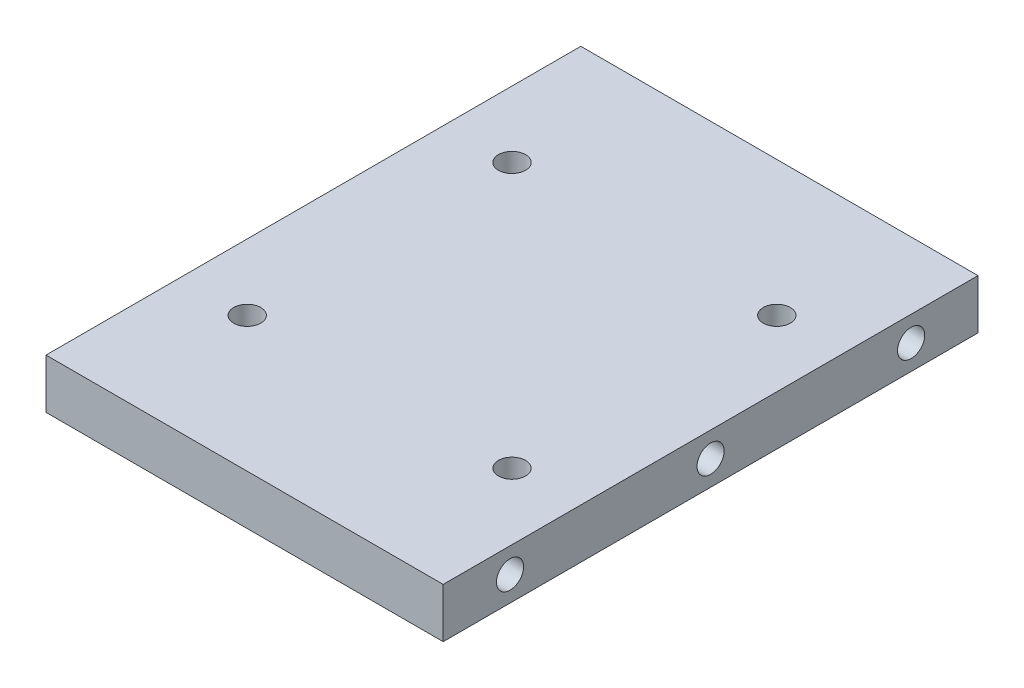
ISO-10303-21;
HEADER;
FILE_DESCRIPTION(('STEP AP214'),'2;1');
FILE_NAME('part.step','',(''),(''),'','','');
FILE_SCHEMA(('AUTOMOTIVE_DESIGN { 1 0 10303 214 1 1 1 1 }'));
ENDSEC;
DATA;
#1=APPLICATION_CONTEXT('core data for automotive mechanical design processes');
#2=APPLICATION_PROTOCOL_DEFINITION('international standard','automotive_design',2000,#1);
#3=PRODUCT_CONTEXT('',#1,'mechanical');
#4=PRODUCT('Part','Part','',(#3));
#5=PRODUCT_RELATED_PRODUCT_CATEGORY('part','',(#4));
#6=PRODUCT_DEFINITION_FORMATION('','',#4);
#7=PRODUCT_DEFINITION_CONTEXT('part definition',#1,'design');
#8=PRODUCT_DEFINITION('design','',#6,#7);
#9=PRODUCT_DEFINITION_SHAPE('','',#8);
#10=(LENGTH_UNIT() NAMED_UNIT(*) SI_UNIT(.MILLI.,.METRE.));
#11=(NAMED_UNIT(*) PLANE_ANGLE_UNIT() SI_UNIT($,.RADIAN.));
#12=(NAMED_UNIT(*) SI_UNIT($,.STERADIAN.) SOLID_ANGLE_UNIT());
#13=UNCERTAINTY_MEASURE_WITH_UNIT(LENGTH_MEASURE(1.E-05),#10,'distance_accuracy_value','');
#14=(GEOMETRIC_REPRESENTATION_CONTEXT(3) GLOBAL_UNCERTAINTY_ASSIGNED_CONTEXT((#13)) GLOBAL_UNIT_ASSIGNED_CONTEXT((#10,
#11,#12)) REPRESENTATION_CONTEXT('',''));
#15=CARTESIAN_POINT('',(0.,0.,0.));
#16=DIRECTION('',(0.,0.,1.));
#17=DIRECTION('',(1.,0.,0.));
#18=AXIS2_PLACEMENT_3D('',#15,#16,#17);
#19=CARTESIAN_POINT('',(0.,79.5,0.));
#20=DIRECTION('',(0.,1.,0.));
#21=DIRECTION('',(0.,0.,1.));
#22=AXIS2_PLACEMENT_3D('',#19,#20,#21);
#23=PLANE('',#22);
#24=CARTESIAN_POINT('',(-25.4,79.5,-25.4));
#25=DIRECTION('',(0.,1.,0.));
#26=DIRECTION('',(0.,0.,1.));
#27=AXIS2_PLACEMENT_3D('',#24,#25,#26);
#28=CIRCLE('',#27,2.6035);
#29=CARTESIAN_POINT('',(-25.4,79.5,-28.0035));
#30=VERTEX_POINT('',#29);
#31=EDGE_CURVE('E121',#30,#30,#28,.T.);
#32=ORIENTED_EDGE('',*,*,#31,.F.);
#33=EDGE_LOOP('',(#32));
#34=FACE_BOUND('',#33,.T.);
#35=CARTESIAN_POINT('',(25.4,79.5,25.4));
#36=DIRECTION('',(0.,1.,0.));
#37=DIRECTION('',(0.,0.,1.));
#38=AXIS2_PLACEMENT_3D('',#35,#36,#37);
#39=CIRCLE('',#38,2.6035);
#40=CARTESIAN_POINT('',(25.4,79.5,22.7965));
#41=VERTEX_POINT('',#40);
#42=EDGE_CURVE('E100',#41,#41,#39,.T.);
#43=ORIENTED_EDGE('',*,*,#42,.F.);
#44=EDGE_LOOP('',(#43));
#45=FACE_BOUND('',#44,.T.);
#46=DIRECTION('',(0.,0.,1.));
#47=VECTOR('',#46,1.);
#48=CARTESIAN_POINT('',(-38.1,79.5,51.3016508018992));
#49=LINE('',#48,#47);
#50=CARTESIAN_POINT('',(-38.1,79.5,-51.3016508018992));
#51=VERTEX_POINT('',#50);
#52=CARTESIAN_POINT('',(-38.1,79.5,51.3016508018992));
#53=VERTEX_POINT('',#52);
#54=EDGE_CURVE('E85',#51,#53,#49,.T.);
#55=ORIENTED_EDGE('',*,*,#54,.T.);
#56=DIRECTION('',(1.,0.,0.));
#57=VECTOR('',#56,1.);
#58=CARTESIAN_POINT('',(-38.1,79.5,51.3016508018992));
#59=LINE('',#58,#57);
#60=CARTESIAN_POINT('',(38.1,79.5,51.3016508018992));
#61=VERTEX_POINT('',#60);
#62=EDGE_CURVE('E80',#53,#61,#59,.T.);
#63=ORIENTED_EDGE('',*,*,#62,.T.);
#64=DIRECTION('',(0.,0.,-1.));
#65=VECTOR('',#64,1.);
#66=CARTESIAN_POINT('',(38.1,79.5,-51.3016508018992));
#67=LINE('',#66,#65);
#68=CARTESIAN_POINT('',(38.1,79.5,-51.3016508018992));
#69=VERTEX_POINT('',#68);
#70=EDGE_CURVE('E83',#61,#69,#67,.T.);
#71=ORIENTED_EDGE('',*,*,#70,.T.);
#72=DIRECTION('',(-1.,0.,0.));
#73=VECTOR('',#72,1.);
#74=CARTESIAN_POINT('',(38.1,79.5,-51.3016508018992));
#75=LINE('',#74,#73);
#76=EDGE_CURVE('E50',#69,#51,#75,.T.);
#77=ORIENTED_EDGE('',*,*,#76,.T.);
#78=EDGE_LOOP('',(#55,#63,#71,#77));
#79=FACE_BOUND('',#78,.T.);
#80=CARTESIAN_POINT('',(-25.4,79.5,25.4));
#81=DIRECTION('',(0.,1.,0.));
#82=DIRECTION('',(0.,0.,1.));
#83=AXIS2_PLACEMENT_3D('',#80,#81,#82);
#84=CIRCLE('',#83,2.6035);
#85=CARTESIAN_POINT('',(-25.4,79.5,22.7965));
#86=VERTEX_POINT('',#85);
#87=EDGE_CURVE('E115',#86,#86,#84,.T.);
#88=ORIENTED_EDGE('',*,*,#87,.F.);
#89=EDGE_LOOP('',(#88));
#90=FACE_BOUND('',#89,.T.);
#91=CARTESIAN_POINT('',(25.4,79.5,-25.4));
#92=DIRECTION('',(0.,1.,0.));
#93=DIRECTION('',(0.,0.,1.));
#94=AXIS2_PLACEMENT_3D('',#91,#92,#93);
#95=CIRCLE('',#94,2.6035);
#96=CARTESIAN_POINT('',(25.4,79.5,-28.0035));
#97=VERTEX_POINT('',#96);
#98=EDGE_CURVE('E127',#97,#97,#95,.T.);
#99=ORIENTED_EDGE('',*,*,#98,.F.);
#100=EDGE_LOOP('',(#99));
#101=FACE_BOUND('',#100,.T.);
#102=ADVANCED_FACE('F33',(#34,#45,#79,#90,#101),#23,.T.);
#103=CARTESIAN_POINT('',(0.,69.975,0.));
#104=DIRECTION('',(0.,1.,0.));
#105=DIRECTION('',(0.,0.,1.));
#106=AXIS2_PLACEMENT_3D('',#103,#104,#105);
#107=PLANE('',#106);
#108=DIRECTION('',(0.,0.,1.));
#109=VECTOR('',#108,1.);
#110=CARTESIAN_POINT('',(-38.1,69.975,51.3016508018992));
#111=LINE('',#110,#109);
#112=CARTESIAN_POINT('',(-38.1,69.975,-51.3016508018992));
#113=VERTEX_POINT('',#112);
#114=CARTESIAN_POINT('',(-38.1,69.975,51.3016508018992));
#115=VERTEX_POINT('',#114);
#116=EDGE_CURVE('E97',#113,#115,#111,.T.);
#117=ORIENTED_EDGE('',*,*,#116,.F.);
#118=DIRECTION('',(-1.,0.,0.));
#119=VECTOR('',#118,1.);
#120=CARTESIAN_POINT('',(38.1,69.975,-51.3016508018992));
#121=LINE('',#120,#119);
#122=CARTESIAN_POINT('',(38.1,69.975,-51.3016508018992));
#123=VERTEX_POINT('',#122);
#124=EDGE_CURVE('E73',#123,#113,#121,.T.);
#125=ORIENTED_EDGE('',*,*,#124,.F.);
#126=DIRECTION('',(0.,0.,-1.));
#127=VECTOR('',#126,1.);
#128=CARTESIAN_POINT('',(38.1,69.975,-51.3016508018992));
#129=LINE('',#128,#127);
#130=CARTESIAN_POINT('',(38.1,69.975,51.3016508018992));
#131=VERTEX_POINT('',#130);
#132=EDGE_CURVE('E67',#131,#123,#129,.T.);
#133=ORIENTED_EDGE('',*,*,#132,.F.);
#134=DIRECTION('',(1.,0.,0.));
#135=VECTOR('',#134,1.);
#136=CARTESIAN_POINT('',(-38.1,69.975,51.3016508018992));
#137=LINE('',#136,#135);
#138=EDGE_CURVE('E89',#115,#131,#137,.T.);
#139=ORIENTED_EDGE('',*,*,#138,.F.);
#140=EDGE_LOOP('',(#117,#125,#133,#139));
#141=FACE_BOUND('',#140,.T.);
#142=CARTESIAN_POINT('',(25.4,69.975,25.4));
#143=DIRECTION('',(0.,1.,0.));
#144=DIRECTION('',(0.,0.,1.));
#145=AXIS2_PLACEMENT_3D('',#142,#143,#144);
#146=CIRCLE('',#145,2.6035);
#147=CARTESIAN_POINT('',(25.4,69.975,22.7965));
#148=VERTEX_POINT('',#147);
#149=EDGE_CURVE('E112',#148,#148,#146,.T.);
#150=ORIENTED_EDGE('',*,*,#149,.T.);
#151=EDGE_LOOP('',(#150));
#152=FACE_BOUND('',#151,.T.);
#153=CARTESIAN_POINT('',(-25.4,69.975,25.4));
#154=DIRECTION('',(0.,1.,0.));
#155=DIRECTION('',(0.,0.,1.));
#156=AXIS2_PLACEMENT_3D('',#153,#154,#155);
#157=CIRCLE('',#156,2.6035);
#158=CARTESIAN_POINT('',(-25.4,69.975,22.7965));
#159=VERTEX_POINT('',#158);
#160=EDGE_CURVE('E118',#159,#159,#157,.T.);
#161=ORIENTED_EDGE('',*,*,#160,.T.);
#162=EDGE_LOOP('',(#161));
#163=FACE_BOUND('',#162,.T.);
#164=CARTESIAN_POINT('',(-25.4,69.975,-25.4));
#165=DIRECTION('',(0.,1.,0.));
#166=DIRECTION('',(0.,0.,1.));
#167=AXIS2_PLACEMENT_3D('',#164,#165,#166);
#168=CIRCLE('',#167,2.6035);
#169=CARTESIAN_POINT('',(-25.4,69.975,-28.0035));
#170=VERTEX_POINT('',#169);
#171=EDGE_CURVE('E124',#170,#170,#168,.T.);
#172=ORIENTED_EDGE('',*,*,#171,.T.);
#173=EDGE_LOOP('',(#172));
#174=FACE_BOUND('',#173,.T.);
#175=CARTESIAN_POINT('',(25.4,69.975,-25.4));
#176=DIRECTION('',(0.,1.,0.));
#177=DIRECTION('',(0.,0.,1.));
#178=AXIS2_PLACEMENT_3D('',#175,#176,#177);
#179=CIRCLE('',#178,2.6035);
#180=CARTESIAN_POINT('',(25.4,69.975,-28.0035));
#181=VERTEX_POINT('',#180);
#182=EDGE_CURVE('E130',#181,#181,#179,.T.);
#183=ORIENTED_EDGE('',*,*,#182,.T.);
#184=EDGE_LOOP('',(#183));
#185=FACE_BOUND('',#184,.T.);
#186=ADVANCED_FACE('F108',(#141,#152,#163,#174,#185),#107,.F.);
#187=CARTESIAN_POINT('',(-38.1,79.5,51.3016508018992));
#188=DIRECTION('',(1.,0.,0.));
#189=DIRECTION('',(0.,0.,-1.));
#190=AXIS2_PLACEMENT_3D('',#187,#188,#189);
#191=PLANE('',#190);
#192=CARTESIAN_POINT('',(-38.1,74.7375,38.4762381014244));
#193=DIRECTION('',(-1.,0.,0.));
#194=DIRECTION('',(0.,0.,-1.));
#195=AXIS2_PLACEMENT_3D('',#192,#193,#194);
#196=CIRCLE('',#195,2.6035);
#197=CARTESIAN_POINT('',(-38.1,74.7375,41.0797381014244));
#198=VERTEX_POINT('',#197);
#199=EDGE_CURVE('E142',#198,#198,#196,.T.);
#200=ORIENTED_EDGE('',*,*,#199,.F.);
#201=EDGE_LOOP('',(#200));
#202=FACE_BOUND('',#201,.T.);
#203=CARTESIAN_POINT('',(-38.1,74.7375,-38.4762381014244));
#204=DIRECTION('',(-1.,0.,0.));
#205=DIRECTION('',(0.,0.,1.));
#206=AXIS2_PLACEMENT_3D('',#203,#204,#205);
#207=CIRCLE('',#206,2.6035);
#208=CARTESIAN_POINT('',(-38.1,74.7375,-35.8727381014244));
#209=VERTEX_POINT('',#208);
#210=EDGE_CURVE('E148',#209,#209,#207,.T.);
#211=ORIENTED_EDGE('',*,*,#210,.F.);
#212=EDGE_LOOP('',(#211));
#213=FACE_BOUND('',#212,.T.);
#214=CARTESIAN_POINT('',(-38.1,74.7375,0.));
#215=DIRECTION('',(-1.,0.,0.));
#216=DIRECTION('',(0.,0.,1.));
#217=AXIS2_PLACEMENT_3D('',#214,#215,#216);
#218=CIRCLE('',#217,2.6035);
#219=CARTESIAN_POINT('',(-38.1,74.7375,2.6035));
#220=VERTEX_POINT('',#219);
#221=EDGE_CURVE('E136',#220,#220,#218,.T.);
#222=ORIENTED_EDGE('',*,*,#221,.F.);
#223=EDGE_LOOP('',(#222));
#224=FACE_BOUND('',#223,.T.);
#225=ORIENTED_EDGE('',*,*,#116,.T.);
#226=DIRECTION('',(0.,-1.,0.));
#227=VECTOR('',#226,1.);
#228=CARTESIAN_POINT('',(-38.1,79.5,51.3016508018992));
#229=LINE('',#228,#227);
#230=EDGE_CURVE('E11',#53,#115,#229,.T.);
#231=ORIENTED_EDGE('',*,*,#230,.F.);
#232=ORIENTED_EDGE('',*,*,#54,.F.);
#233=DIRECTION('',(0.,-1.,0.));
#234=VECTOR('',#233,1.);
#235=CARTESIAN_POINT('',(-38.1,79.5,-51.3016508018992));
#236=LINE('',#235,#234);
#237=EDGE_CURVE('E93',#51,#113,#236,.T.);
#238=ORIENTED_EDGE('',*,*,#237,.T.);
#239=EDGE_LOOP('',(#225,#231,#232,#238));
#240=FACE_BOUND('',#239,.T.);
#241=ADVANCED_FACE('F35',(#202,#213,#224,#240),#191,.F.);
#242=CARTESIAN_POINT('',(-38.1,79.5,51.3016508018992));
#243=DIRECTION('',(0.,0.,-1.));
#244=DIRECTION('',(-1.,0.,0.));
#245=AXIS2_PLACEMENT_3D('',#242,#243,#244);
#246=PLANE('',#245);
#247=ORIENTED_EDGE('',*,*,#138,.T.);
#248=DIRECTION('',(0.,-1.,0.));
#249=VECTOR('',#248,1.);
#250=CARTESIAN_POINT('',(38.1,79.5,51.3016508018992));
#251=LINE('',#250,#249);
#252=EDGE_CURVE('E42',#61,#131,#251,.T.);
#253=ORIENTED_EDGE('',*,*,#252,.F.);
#254=ORIENTED_EDGE('',*,*,#62,.F.);
#255=ORIENTED_EDGE('',*,*,#230,.T.);
#256=EDGE_LOOP('',(#247,#253,#254,#255));
#257=FACE_BOUND('',#256,.T.);
#258=ADVANCED_FACE('F88',(#257),#246,.F.);
#259=CARTESIAN_POINT('',(38.1,79.5,-51.3016508018992));
#260=DIRECTION('',(-1.,0.,0.));
#261=DIRECTION('',(0.,0.,1.));
#262=AXIS2_PLACEMENT_3D('',#259,#260,#261);
#263=PLANE('',#262);
#264=CARTESIAN_POINT('',(38.1,74.7375,38.4762381014244));
#265=DIRECTION('',(-1.,0.,0.));
#266=DIRECTION('',(0.,0.,-1.));
#267=AXIS2_PLACEMENT_3D('',#264,#265,#266);
#268=CIRCLE('',#267,2.6035);
#269=CARTESIAN_POINT('',(38.1,74.7375,41.0797381014244));
#270=VERTEX_POINT('',#269);
#271=EDGE_CURVE('E145',#270,#270,#268,.T.);
#272=ORIENTED_EDGE('',*,*,#271,.T.);
#273=EDGE_LOOP('',(#272));
#274=FACE_BOUND('',#273,.T.);
#275=CARTESIAN_POINT('',(38.1,74.7375,-38.4762381014244));
#276=DIRECTION('',(-1.,0.,0.));
#277=DIRECTION('',(0.,0.,1.));
#278=AXIS2_PLACEMENT_3D('',#275,#276,#277);
#279=CIRCLE('',#278,2.6035);
#280=CARTESIAN_POINT('',(38.1,74.7375,-35.8727381014244));
#281=VERTEX_POINT('',#280);
#282=EDGE_CURVE('E139',#281,#281,#279,.T.);
#283=ORIENTED_EDGE('',*,*,#282,.T.);
#284=EDGE_LOOP('',(#283));
#285=FACE_BOUND('',#284,.T.);
#286=CARTESIAN_POINT('',(38.1,74.7375,0.));
#287=DIRECTION('',(-1.,0.,0.));
#288=DIRECTION('',(0.,0.,1.));
#289=AXIS2_PLACEMENT_3D('',#286,#287,#288);
#290=CIRCLE('',#289,2.6035);
#291=CARTESIAN_POINT('',(38.1,74.7375,2.6035));
#292=VERTEX_POINT('',#291);
#293=EDGE_CURVE('E133',#292,#292,#290,.T.);
#294=ORIENTED_EDGE('',*,*,#293,.T.);
#295=EDGE_LOOP('',(#294));
#296=FACE_BOUND('',#295,.T.);
#297=ORIENTED_EDGE('',*,*,#132,.T.);
#298=DIRECTION('',(0.,-1.,0.));
#299=VECTOR('',#298,1.);
#300=CARTESIAN_POINT('',(38.1,79.5,-51.3016508018992));
#301=LINE('',#300,#299);
#302=EDGE_CURVE('E90',#69,#123,#301,.T.);
#303=ORIENTED_EDGE('',*,*,#302,.F.);
#304=ORIENTED_EDGE('',*,*,#70,.F.);
#305=ORIENTED_EDGE('',*,*,#252,.T.);
#306=EDGE_LOOP('',(#297,#303,#304,#305));
#307=FACE_BOUND('',#306,.T.);
#308=ADVANCED_FACE('F91',(#274,#285,#296,#307),#263,.F.);
#309=CARTESIAN_POINT('',(38.1,79.5,-51.3016508018992));
#310=DIRECTION('',(0.,0.,1.));
#311=DIRECTION('',(1.,0.,0.));
#312=AXIS2_PLACEMENT_3D('',#309,#310,#311);
#313=PLANE('',#312);
#314=ORIENTED_EDGE('',*,*,#124,.T.);
#315=ORIENTED_EDGE('',*,*,#237,.F.);
#316=ORIENTED_EDGE('',*,*,#76,.F.);
#317=ORIENTED_EDGE('',*,*,#302,.T.);
#318=EDGE_LOOP('',(#314,#315,#316,#317));
#319=FACE_BOUND('',#318,.T.);
#320=ADVANCED_FACE('F105',(#319),#313,.F.);
#321=CARTESIAN_POINT('',(25.4,79.5,25.4));
#322=DIRECTION('',(0.,-1.,0.));
#323=DIRECTION('',(0.,0.,-1.));
#324=AXIS2_PLACEMENT_3D('',#321,#322,#323);
#325=CYLINDRICAL_SURFACE('',#324,2.6035);
#326=CARTESIAN_POINT('',(25.4,79.5,22.7965));
#327=CARTESIAN_POINT('',(25.4,79.40078125,22.7965));
#328=CARTESIAN_POINT('',(25.4,79.3015625,22.7965));
#329=CARTESIAN_POINT('',(25.4,79.103125,22.7965));
#330=CARTESIAN_POINT('',(25.4,79.00390625,22.7965));
#331=CARTESIAN_POINT('',(25.4,78.80546875,22.7965));
#332=CARTESIAN_POINT('',(25.4,78.70625,22.7965));
#333=CARTESIAN_POINT('',(25.4,78.5078125,22.7965));
#334=CARTESIAN_POINT('',(25.4,78.40859375,22.7965));
#335=CARTESIAN_POINT('',(25.4,78.21015625,22.7965));
#336=CARTESIAN_POINT('',(25.4,78.1109375,22.7965));
#337=CARTESIAN_POINT('',(25.4,77.9125,22.7965));
#338=CARTESIAN_POINT('',(25.4,77.81328125,22.7965));
#339=CARTESIAN_POINT('',(25.4,77.61484375,22.7965));
#340=CARTESIAN_POINT('',(25.4,77.515625,22.7965));
#341=CARTESIAN_POINT('',(25.4,77.3171875,22.7965));
#342=CARTESIAN_POINT('',(25.4,77.21796875,22.7965));
#343=CARTESIAN_POINT('',(25.4,77.01953125,22.7965));
#344=CARTESIAN_POINT('',(25.4,76.9203125,22.7965));
#345=CARTESIAN_POINT('',(25.4,76.721875,22.7965));
#346=CARTESIAN_POINT('',(25.4,76.62265625,22.7965));
#347=CARTESIAN_POINT('',(25.4,76.42421875,22.7965));
#348=CARTESIAN_POINT('',(25.4,76.325,22.7965));
#349=CARTESIAN_POINT('',(25.4,76.1265625,22.7965));
#350=CARTESIAN_POINT('',(25.4,76.02734375,22.7965));
#351=CARTESIAN_POINT('',(25.4,75.82890625,22.7965));
#352=CARTESIAN_POINT('',(25.4,75.7296875,22.7965));
#353=CARTESIAN_POINT('',(25.4,75.53125,22.7965));
#354=CARTESIAN_POINT('',(25.4,75.43203125,22.7965));
#355=CARTESIAN_POINT('',(25.4,75.23359375,22.7965));
#356=CARTESIAN_POINT('',(25.4,75.134375,22.7965));
#357=CARTESIAN_POINT('',(25.4,74.9359375,22.7965));
#358=CARTESIAN_POINT('',(25.4,74.83671875,22.7965));
#359=CARTESIAN_POINT('',(25.4,74.63828125,22.7965));
#360=CARTESIAN_POINT('',(25.4,74.5390625,22.7965));
#361=CARTESIAN_POINT('',(25.4,74.340625,22.7965));
#362=CARTESIAN_POINT('',(25.4,74.24140625,22.7965));
#363=CARTESIAN_POINT('',(25.4,74.04296875,22.7965));
#364=CARTESIAN_POINT('',(25.4,73.94375,22.7965));
#365=CARTESIAN_POINT('',(25.4,73.7453125,22.7965));
#366=CARTESIAN_POINT('',(25.4,73.64609375,22.7965));
#367=CARTESIAN_POINT('',(25.4,73.44765625,22.7965));
#368=CARTESIAN_POINT('',(25.4,73.3484375,22.7965));
#369=CARTESIAN_POINT('',(25.4,73.15,22.7965));
#370=CARTESIAN_POINT('',(25.4,73.05078125,22.7965));
#371=CARTESIAN_POINT('',(25.4,72.85234375,22.7965));
#372=CARTESIAN_POINT('',(25.4,72.753125,22.7965));
#373=CARTESIAN_POINT('',(25.4,72.5546875,22.7965));
#374=CARTESIAN_POINT('',(25.4,72.45546875,22.7965));
#375=CARTESIAN_POINT('',(25.4,72.25703125,22.7965));
#376=CARTESIAN_POINT('',(25.4,72.1578125,22.7965));
#377=CARTESIAN_POINT('',(25.4,71.959375,22.7965));
#378=CARTESIAN_POINT('',(25.4,71.86015625,22.7965));
#379=CARTESIAN_POINT('',(25.4,71.66171875,22.7965));
#380=CARTESIAN_POINT('',(25.4,71.5625,22.7965));
#381=CARTESIAN_POINT('',(25.4,71.3640625,22.7965));
#382=CARTESIAN_POINT('',(25.4,71.26484375,22.7965));
#383=CARTESIAN_POINT('',(25.4,71.06640625,22.7965));
#384=CARTESIAN_POINT('',(25.4,70.9671875,22.7965));
#385=CARTESIAN_POINT('',(25.4,70.76875,22.7965));
#386=CARTESIAN_POINT('',(25.4,70.66953125,22.7965));
#387=CARTESIAN_POINT('',(25.4,70.47109375,22.7965));
#388=CARTESIAN_POINT('',(25.4,70.371875,22.7965));
#389=CARTESIAN_POINT('',(25.4,70.1734375,22.7965));
#390=CARTESIAN_POINT('',(25.4,70.07421875,22.7965));
#391=CARTESIAN_POINT('',(25.4,69.975,22.7965));
#392=B_SPLINE_CURVE_WITH_KNOTS('',3,(#326,#327,#328,#329,#330,#331,#332,#333,#334,#335,#336,
#337,#338,#339,#340,#341,#342,#343,#344,#345,#346,#347,#348,#349,#350,#351,#352,#353,#354,#355,
#356,#357,#358,#359,#360,#361,#362,#363,#364,#365,#366,#367,#368,#369,#370,#371,#372,#373,#374,
#375,#376,#377,#378,#379,#380,#381,#382,#383,#384,#385,#386,#387,#388,#389,#390,#391),
.UNSPECIFIED.,.F.,.F.,(4,2,2,2,2,2,2,2,2,2,2,2,2,2,2,2,2,2,2,2,2,2,2,2,2,2,2,2,2,2,2,2,4),(0.,
0.297656249999986,0.595312499999986,0.892968749999987,1.19062499999999,1.48828124999999,
1.78593749999999,2.08359374999999,2.38124999999999,2.67890624999999,2.97656249999999,
3.27421874999999,3.57187499999999,3.86953124999999,4.16718749999999,4.46484374999999,
4.76249999999999,5.06015624999999,5.35781249999999,5.65546874999999,5.95312499999999,
6.25078124999999,6.54843749999999,6.84609374999999,7.14374999999999,7.44140624999999,
7.73906249999999,8.03671874999999,8.33437499999999,8.63203124999999,8.92968749999999,
9.22734374999999,9.52499999999999),.UNSPECIFIED.);
#393=EDGE_CURVE('BSEAM191',#41,#148,#392,.T.);
#394=ORIENTED_EDGE('',*,*,#42,.T.);
#395=ORIENTED_EDGE('',*,*,#149,.F.);
#396=ORIENTED_EDGE('',*,*,#393,.T.);
#397=ORIENTED_EDGE('',*,*,#393,.F.);
#398=EDGE_LOOP('',(#394,#396,#395,#397));
#399=FACE_BOUND('',#398,.T.);
#400=ADVANCED_FACE('F191',(#399),#325,.F.);
#401=CARTESIAN_POINT('',(-25.4,79.5,25.4));
#402=DIRECTION('',(0.,-1.,0.));
#403=DIRECTION('',(0.,0.,-1.));
#404=AXIS2_PLACEMENT_3D('',#401,#402,#403);
#405=CYLINDRICAL_SURFACE('',#404,2.6035);
#406=CARTESIAN_POINT('',(-25.4,79.5,22.7965));
#407=CARTESIAN_POINT('',(-25.4,79.40078125,22.7965));
#408=CARTESIAN_POINT('',(-25.4,79.3015625,22.7965));
#409=CARTESIAN_POINT('',(-25.4,79.103125,22.7965));
#410=CARTESIAN_POINT('',(-25.4,79.00390625,22.7965));
#411=CARTESIAN_POINT('',(-25.4,78.80546875,22.7965));
#412=CARTESIAN_POINT('',(-25.4,78.70625,22.7965));
#413=CARTESIAN_POINT('',(-25.4,78.5078125,22.7965));
#414=CARTESIAN_POINT('',(-25.4,78.40859375,22.7965));
#415=CARTESIAN_POINT('',(-25.4,78.21015625,22.7965));
#416=CARTESIAN_POINT('',(-25.4,78.1109375,22.7965));
#417=CARTESIAN_POINT('',(-25.4,77.9125,22.7965));
#418=CARTESIAN_POINT('',(-25.4,77.81328125,22.7965));
#419=CARTESIAN_POINT('',(-25.4,77.61484375,22.7965));
#420=CARTESIAN_POINT('',(-25.4,77.515625,22.7965));
#421=CARTESIAN_POINT('',(-25.4,77.3171875,22.7965));
#422=CARTESIAN_POINT('',(-25.4,77.21796875,22.7965));
#423=CARTESIAN_POINT('',(-25.4,77.01953125,22.7965));
#424=CARTESIAN_POINT('',(-25.4,76.9203125,22.7965));
#425=CARTESIAN_POINT('',(-25.4,76.721875,22.7965));
#426=CARTESIAN_POINT('',(-25.4,76.62265625,22.7965));
#427=CARTESIAN_POINT('',(-25.4,76.42421875,22.7965));
#428=CARTESIAN_POINT('',(-25.4,76.325,22.7965));
#429=CARTESIAN_POINT('',(-25.4,76.1265625,22.7965));
#430=CARTESIAN_POINT('',(-25.4,76.02734375,22.7965));
#431=CARTESIAN_POINT('',(-25.4,75.82890625,22.7965));
#432=CARTESIAN_POINT('',(-25.4,75.7296875,22.7965));
#433=CARTESIAN_POINT('',(-25.4,75.53125,22.7965));
#434=CARTESIAN_POINT('',(-25.4,75.43203125,22.7965));
#435=CARTESIAN_POINT('',(-25.4,75.23359375,22.7965));
#436=CARTESIAN_POINT('',(-25.4,75.134375,22.7965));
#437=CARTESIAN_POINT('',(-25.4,74.9359375,22.7965));
#438=CARTESIAN_POINT('',(-25.4,74.83671875,22.7965));
#439=CARTESIAN_POINT('',(-25.4,74.63828125,22.7965));
#440=CARTESIAN_POINT('',(-25.4,74.5390625,22.7965));
#441=CARTESIAN_POINT('',(-25.4,74.340625,22.7965));
#442=CARTESIAN_POINT('',(-25.4,74.24140625,22.7965));
#443=CARTESIAN_POINT('',(-25.4,74.04296875,22.7965));
#444=CARTESIAN_POINT('',(-25.4,73.94375,22.7965));
#445=CARTESIAN_POINT('',(-25.4,73.7453125,22.7965));
#446=CARTESIAN_POINT('',(-25.4,73.64609375,22.7965));
#447=CARTESIAN_POINT('',(-25.4,73.44765625,22.7965));
#448=CARTESIAN_POINT('',(-25.4,73.3484375,22.7965));
#449=CARTESIAN_POINT('',(-25.4,73.15,22.7965));
#450=CARTESIAN_POINT('',(-25.4,73.05078125,22.7965));
#451=CARTESIAN_POINT('',(-25.4,72.85234375,22.7965));
#452=CARTESIAN_POINT('',(-25.4,72.753125,22.7965));
#453=CARTESIAN_POINT('',(-25.4,72.5546875,22.7965));
#454=CARTESIAN_POINT('',(-25.4,72.45546875,22.7965));
#455=CARTESIAN_POINT('',(-25.4,72.25703125,22.7965));
#456=CARTESIAN_POINT('',(-25.4,72.1578125,22.7965));
#457=CARTESIAN_POINT('',(-25.4,71.959375,22.7965));
#458=CARTESIAN_POINT('',(-25.4,71.86015625,22.7965));
#459=CARTESIAN_POINT('',(-25.4,71.66171875,22.7965));
#460=CARTESIAN_POINT('',(-25.4,71.5625,22.7965));
#461=CARTESIAN_POINT('',(-25.4,71.3640625,22.7965));
#462=CARTESIAN_POINT('',(-25.4,71.26484375,22.7965));
#463=CARTESIAN_POINT('',(-25.4,71.06640625,22.7965));
#464=CARTESIAN_POINT('',(-25.4,70.9671875,22.7965));
#465=CARTESIAN_POINT('',(-25.4,70.76875,22.7965));
#466=CARTESIAN_POINT('',(-25.4,70.66953125,22.7965));
#467=CARTESIAN_POINT('',(-25.4,70.47109375,22.7965));
#468=CARTESIAN_POINT('',(-25.4,70.371875,22.7965));
#469=CARTESIAN_POINT('',(-25.4,70.1734375,22.7965));
#470=CARTESIAN_POINT('',(-25.4,70.07421875,22.7965));
#471=CARTESIAN_POINT('',(-25.4,69.975,22.7965));
#472=B_SPLINE_CURVE_WITH_KNOTS('',3,(#406,#407,#408,#409,#410,#411,#412,#413,#414,#415,#416,
#417,#418,#419,#420,#421,#422,#423,#424,#425,#426,#427,#428,#429,#430,#431,#432,#433,#434,#435,
#436,#437,#438,#439,#440,#441,#442,#443,#444,#445,#446,#447,#448,#449,#450,#451,#452,#453,#454,
#455,#456,#457,#458,#459,#460,#461,#462,#463,#464,#465,#466,#467,#468,#469,#470,#471),
.UNSPECIFIED.,.F.,.F.,(4,2,2,2,2,2,2,2,2,2,2,2,2,2,2,2,2,2,2,2,2,2,2,2,2,2,2,2,2,2,2,2,4),(0.,
0.297656249999986,0.595312499999986,0.892968749999987,1.19062499999999,1.48828124999999,
1.78593749999999,2.08359374999999,2.38124999999999,2.67890624999999,2.97656249999999,
3.27421874999999,3.57187499999999,3.86953124999999,4.16718749999999,4.46484374999999,
4.76249999999999,5.06015624999999,5.35781249999999,5.65546874999999,5.95312499999999,
6.25078124999999,6.54843749999999,6.84609374999999,7.14374999999999,7.44140624999999,
7.73906249999999,8.03671874999999,8.33437499999999,8.63203124999999,8.92968749999999,
9.22734374999999,9.52499999999999),.UNSPECIFIED.);
#473=EDGE_CURVE('BSEAM218',#86,#159,#472,.T.);
#474=ORIENTED_EDGE('',*,*,#87,.T.);
#475=ORIENTED_EDGE('',*,*,#160,.F.);
#476=ORIENTED_EDGE('',*,*,#473,.T.);
#477=ORIENTED_EDGE('',*,*,#473,.F.);
#478=EDGE_LOOP('',(#474,#476,#475,#477));
#479=FACE_BOUND('',#478,.T.);
#480=ADVANCED_FACE('F218',(#479),#405,.F.);
#481=CARTESIAN_POINT('',(-25.4,79.5,-25.4));
#482=DIRECTION('',(0.,-1.,0.));
#483=DIRECTION('',(0.,0.,-1.));
#484=AXIS2_PLACEMENT_3D('',#481,#482,#483);
#485=CYLINDRICAL_SURFACE('',#484,2.6035);
#486=CARTESIAN_POINT('',(-25.4,79.5,-28.0035));
#487=CARTESIAN_POINT('',(-25.4,79.40078125,-28.0035));
#488=CARTESIAN_POINT('',(-25.4,79.3015625,-28.0035));
#489=CARTESIAN_POINT('',(-25.4,79.103125,-28.0035));
#490=CARTESIAN_POINT('',(-25.4,79.00390625,-28.0035));
#491=CARTESIAN_POINT('',(-25.4,78.80546875,-28.0035));
#492=CARTESIAN_POINT('',(-25.4,78.70625,-28.0035));
#493=CARTESIAN_POINT('',(-25.4,78.5078125,-28.0035));
#494=CARTESIAN_POINT('',(-25.4,78.40859375,-28.0035));
#495=CARTESIAN_POINT('',(-25.4,78.21015625,-28.0035));
#496=CARTESIAN_POINT('',(-25.4,78.1109375,-28.0035));
#497=CARTESIAN_POINT('',(-25.4,77.9125,-28.0035));
#498=CARTESIAN_POINT('',(-25.4,77.81328125,-28.0035));
#499=CARTESIAN_POINT('',(-25.4,77.61484375,-28.0035));
#500=CARTESIAN_POINT('',(-25.4,77.515625,-28.0035));
#501=CARTESIAN_POINT('',(-25.4,77.3171875,-28.0035));
#502=CARTESIAN_POINT('',(-25.4,77.21796875,-28.0035));
#503=CARTESIAN_POINT('',(-25.4,77.01953125,-28.0035));
#504=CARTESIAN_POINT('',(-25.4,76.9203125,-28.0035));
#505=CARTESIAN_POINT('',(-25.4,76.721875,-28.0035));
#506=CARTESIAN_POINT('',(-25.4,76.62265625,-28.0035));
#507=CARTESIAN_POINT('',(-25.4,76.42421875,-28.0035));
#508=CARTESIAN_POINT('',(-25.4,76.325,-28.0035));
#509=CARTESIAN_POINT('',(-25.4,76.1265625,-28.0035));
#510=CARTESIAN_POINT('',(-25.4,76.02734375,-28.0035));
#511=CARTESIAN_POINT('',(-25.4,75.82890625,-28.0035));
#512=CARTESIAN_POINT('',(-25.4,75.7296875,-28.0035));
#513=CARTESIAN_POINT('',(-25.4,75.53125,-28.0035));
#514=CARTESIAN_POINT('',(-25.4,75.43203125,-28.0035));
#515=CARTESIAN_POINT('',(-25.4,75.23359375,-28.0035));
#516=CARTESIAN_POINT('',(-25.4,75.134375,-28.0035));
#517=CARTESIAN_POINT('',(-25.4,74.9359375,-28.0035));
#518=CARTESIAN_POINT('',(-25.4,74.83671875,-28.0035));
#519=CARTESIAN_POINT('',(-25.4,74.63828125,-28.0035));
#520=CARTESIAN_POINT('',(-25.4,74.5390625,-28.0035));
#521=CARTESIAN_POINT('',(-25.4,74.340625,-28.0035));
#522=CARTESIAN_POINT('',(-25.4,74.24140625,-28.0035));
#523=CARTESIAN_POINT('',(-25.4,74.04296875,-28.0035));
#524=CARTESIAN_POINT('',(-25.4,73.94375,-28.0035));
#525=CARTESIAN_POINT('',(-25.4,73.7453125,-28.0035));
#526=CARTESIAN_POINT('',(-25.4,73.64609375,-28.0035));
#527=CARTESIAN_POINT('',(-25.4,73.44765625,-28.0035));
#528=CARTESIAN_POINT('',(-25.4,73.3484375,-28.0035));
#529=CARTESIAN_POINT('',(-25.4,73.15,-28.0035));
#530=CARTESIAN_POINT('',(-25.4,73.05078125,-28.0035));
#531=CARTESIAN_POINT('',(-25.4,72.85234375,-28.0035));
#532=CARTESIAN_POINT('',(-25.4,72.753125,-28.0035));
#533=CARTESIAN_POINT('',(-25.4,72.5546875,-28.0035));
#534=CARTESIAN_POINT('',(-25.4,72.45546875,-28.0035));
#535=CARTESIAN_POINT('',(-25.4,72.25703125,-28.0035));
#536=CARTESIAN_POINT('',(-25.4,72.1578125,-28.0035));
#537=CARTESIAN_POINT('',(-25.4,71.959375,-28.0035));
#538=CARTESIAN_POINT('',(-25.4,71.86015625,-28.0035));
#539=CARTESIAN_POINT('',(-25.4,71.66171875,-28.0035));
#540=CARTESIAN_POINT('',(-25.4,71.5625,-28.0035));
#541=CARTESIAN_POINT('',(-25.4,71.3640625,-28.0035));
#542=CARTESIAN_POINT('',(-25.4,71.26484375,-28.0035));
#543=CARTESIAN_POINT('',(-25.4,71.06640625,-28.0035));
#544=CARTESIAN_POINT('',(-25.4,70.9671875,-28.0035));
#545=CARTESIAN_POINT('',(-25.4,70.76875,-28.0035));
#546=CARTESIAN_POINT('',(-25.4,70.66953125,-28.0035));
#547=CARTESIAN_POINT('',(-25.4,70.47109375,-28.0035));
#548=CARTESIAN_POINT('',(-25.4,70.371875,-28.0035));
#549=CARTESIAN_POINT('',(-25.4,70.1734375,-28.0035));
#550=CARTESIAN_POINT('',(-25.4,70.07421875,-28.0035));
#551=CARTESIAN_POINT('',(-25.4,69.975,-28.0035));
#552=B_SPLINE_CURVE_WITH_KNOTS('',3,(#486,#487,#488,#489,#490,#491,#492,#493,#494,#495,#496,
#497,#498,#499,#500,#501,#502,#503,#504,#505,#506,#507,#508,#509,#510,#511,#512,#513,#514,#515,
#516,#517,#518,#519,#520,#521,#522,#523,#524,#525,#526,#527,#528,#529,#530,#531,#532,#533,#534,
#535,#536,#537,#538,#539,#540,#541,#542,#543,#544,#545,#546,#547,#548,#549,#550,#551),
.UNSPECIFIED.,.F.,.F.,(4,2,2,2,2,2,2,2,2,2,2,2,2,2,2,2,2,2,2,2,2,2,2,2,2,2,2,2,2,2,2,2,4),(0.,
0.297656249999986,0.595312499999986,0.892968749999987,1.19062499999999,1.48828124999999,
1.78593749999999,2.08359374999999,2.38124999999999,2.67890624999999,2.97656249999999,
3.27421874999999,3.57187499999999,3.86953124999999,4.16718749999999,4.46484374999999,
4.76249999999999,5.06015624999999,5.35781249999999,5.65546874999999,5.95312499999999,
6.25078124999999,6.54843749999999,6.84609374999999,7.14374999999999,7.44140624999999,
7.73906249999999,8.03671874999999,8.33437499999999,8.63203124999999,8.92968749999999,
9.22734374999999,9.52499999999999),.UNSPECIFIED.);
#553=EDGE_CURVE('BSEAM176',#30,#170,#552,.T.);
#554=ORIENTED_EDGE('',*,*,#31,.T.);
#555=ORIENTED_EDGE('',*,*,#171,.F.);
#556=ORIENTED_EDGE('',*,*,#553,.T.);
#557=ORIENTED_EDGE('',*,*,#553,.F.);
#558=EDGE_LOOP('',(#554,#556,#555,#557));
#559=FACE_BOUND('',#558,.T.);
#560=ADVANCED_FACE('F176',(#559),#485,.F.);
#561=CARTESIAN_POINT('',(25.4,79.5,-25.4));
#562=DIRECTION('',(0.,-1.,0.));
#563=DIRECTION('',(0.,0.,-1.));
#564=AXIS2_PLACEMENT_3D('',#561,#562,#563);
#565=CYLINDRICAL_SURFACE('',#564,2.6035);
#566=CARTESIAN_POINT('',(25.4,79.5,-28.0035));
#567=CARTESIAN_POINT('',(25.4,79.40078125,-28.0035));
#568=CARTESIAN_POINT('',(25.4,79.3015625,-28.0035));
#569=CARTESIAN_POINT('',(25.4,79.103125,-28.0035));
#570=CARTESIAN_POINT('',(25.4,79.00390625,-28.0035));
#571=CARTESIAN_POINT('',(25.4,78.80546875,-28.0035));
#572=CARTESIAN_POINT('',(25.4,78.70625,-28.0035));
#573=CARTESIAN_POINT('',(25.4,78.5078125,-28.0035));
#574=CARTESIAN_POINT('',(25.4,78.40859375,-28.0035));
#575=CARTESIAN_POINT('',(25.4,78.21015625,-28.0035));
#576=CARTESIAN_POINT('',(25.4,78.1109375,-28.0035));
#577=CARTESIAN_POINT('',(25.4,77.9125,-28.0035));
#578=CARTESIAN_POINT('',(25.4,77.81328125,-28.0035));
#579=CARTESIAN_POINT('',(25.4,77.61484375,-28.0035));
#580=CARTESIAN_POINT('',(25.4,77.515625,-28.0035));
#581=CARTESIAN_POINT('',(25.4,77.3171875,-28.0035));
#582=CARTESIAN_POINT('',(25.4,77.21796875,-28.0035));
#583=CARTESIAN_POINT('',(25.4,77.01953125,-28.0035));
#584=CARTESIAN_POINT('',(25.4,76.9203125,-28.0035));
#585=CARTESIAN_POINT('',(25.4,76.721875,-28.0035));
#586=CARTESIAN_POINT('',(25.4,76.62265625,-28.0035));
#587=CARTESIAN_POINT('',(25.4,76.42421875,-28.0035));
#588=CARTESIAN_POINT('',(25.4,76.325,-28.0035));
#589=CARTESIAN_POINT('',(25.4,76.1265625,-28.0035));
#590=CARTESIAN_POINT('',(25.4,76.02734375,-28.0035));
#591=CARTESIAN_POINT('',(25.4,75.82890625,-28.0035));
#592=CARTESIAN_POINT('',(25.4,75.7296875,-28.0035));
#593=CARTESIAN_POINT('',(25.4,75.53125,-28.0035));
#594=CARTESIAN_POINT('',(25.4,75.43203125,-28.0035));
#595=CARTESIAN_POINT('',(25.4,75.23359375,-28.0035));
#596=CARTESIAN_POINT('',(25.4,75.134375,-28.0035));
#597=CARTESIAN_POINT('',(25.4,74.9359375,-28.0035));
#598=CARTESIAN_POINT('',(25.4,74.83671875,-28.0035));
#599=CARTESIAN_POINT('',(25.4,74.63828125,-28.0035));
#600=CARTESIAN_POINT('',(25.4,74.5390625,-28.0035));
#601=CARTESIAN_POINT('',(25.4,74.340625,-28.0035));
#602=CARTESIAN_POINT('',(25.4,74.24140625,-28.0035));
#603=CARTESIAN_POINT('',(25.4,74.04296875,-28.0035));
#604=CARTESIAN_POINT('',(25.4,73.94375,-28.0035));
#605=CARTESIAN_POINT('',(25.4,73.7453125,-28.0035));
#606=CARTESIAN_POINT('',(25.4,73.64609375,-28.0035));
#607=CARTESIAN_POINT('',(25.4,73.44765625,-28.0035));
#608=CARTESIAN_POINT('',(25.4,73.3484375,-28.0035));
#609=CARTESIAN_POINT('',(25.4,73.15,-28.0035));
#610=CARTESIAN_POINT('',(25.4,73.05078125,-28.0035));
#611=CARTESIAN_POINT('',(25.4,72.85234375,-28.0035));
#612=CARTESIAN_POINT('',(25.4,72.753125,-28.0035));
#613=CARTESIAN_POINT('',(25.4,72.5546875,-28.0035));
#614=CARTESIAN_POINT('',(25.4,72.45546875,-28.0035));
#615=CARTESIAN_POINT('',(25.4,72.25703125,-28.0035));
#616=CARTESIAN_POINT('',(25.4,72.1578125,-28.0035));
#617=CARTESIAN_POINT('',(25.4,71.959375,-28.0035));
#618=CARTESIAN_POINT('',(25.4,71.86015625,-28.0035));
#619=CARTESIAN_POINT('',(25.4,71.66171875,-28.0035));
#620=CARTESIAN_POINT('',(25.4,71.5625,-28.0035));
#621=CARTESIAN_POINT('',(25.4,71.3640625,-28.0035));
#622=CARTESIAN_POINT('',(25.4,71.26484375,-28.0035));
#623=CARTESIAN_POINT('',(25.4,71.06640625,-28.0035));
#624=CARTESIAN_POINT('',(25.4,70.9671875,-28.0035));
#625=CARTESIAN_POINT('',(25.4,70.76875,-28.0035));
#626=CARTESIAN_POINT('',(25.4,70.66953125,-28.0035));
#627=CARTESIAN_POINT('',(25.4,70.47109375,-28.0035));
#628=CARTESIAN_POINT('',(25.4,70.371875,-28.0035));
#629=CARTESIAN_POINT('',(25.4,70.1734375,-28.0035));
#630=CARTESIAN_POINT('',(25.4,70.07421875,-28.0035));
#631=CARTESIAN_POINT('',(25.4,69.975,-28.0035));
#632=B_SPLINE_CURVE_WITH_KNOTS('',3,(#566,#567,#568,#569,#570,#571,#572,#573,#574,#575,#576,
#577,#578,#579,#580,#581,#582,#583,#584,#585,#586,#587,#588,#589,#590,#591,#592,#593,#594,#595,
#596,#597,#598,#599,#600,#601,#602,#603,#604,#605,#606,#607,#608,#609,#610,#611,#612,#613,#614,
#615,#616,#617,#618,#619,#620,#621,#622,#623,#624,#625,#626,#627,#628,#629,#630,#631),
.UNSPECIFIED.,.F.,.F.,(4,2,2,2,2,2,2,2,2,2,2,2,2,2,2,2,2,2,2,2,2,2,2,2,2,2,2,2,2,2,2,2,4),(0.,
0.297656249999986,0.595312499999986,0.892968749999987,1.19062499999999,1.48828124999999,
1.78593749999999,2.08359374999999,2.38124999999999,2.67890624999999,2.97656249999999,
3.27421874999999,3.57187499999999,3.86953124999999,4.16718749999999,4.46484374999999,
4.76249999999999,5.06015624999999,5.35781249999999,5.65546874999999,5.95312499999999,
6.25078124999999,6.54843749999999,6.84609374999999,7.14374999999999,7.44140624999999,
7.73906249999999,8.03671874999999,8.33437499999999,8.63203124999999,8.92968749999999,
9.22734374999999,9.52499999999999),.UNSPECIFIED.);
#633=EDGE_CURVE('BSEAM170',#97,#181,#632,.T.);
#634=ORIENTED_EDGE('',*,*,#98,.T.);
#635=ORIENTED_EDGE('',*,*,#182,.F.);
#636=ORIENTED_EDGE('',*,*,#633,.T.);
#637=ORIENTED_EDGE('',*,*,#633,.F.);
#638=EDGE_LOOP('',(#634,#636,#635,#637));
#639=FACE_BOUND('',#638,.T.);
#640=ADVANCED_FACE('F170',(#639),#565,.F.);
#641=CARTESIAN_POINT('',(38.1,74.7375,0.));
#642=DIRECTION('',(-1.,0.,0.));
#643=DIRECTION('',(0.,0.,1.));
#644=AXIS2_PLACEMENT_3D('',#641,#642,#643);
#645=CYLINDRICAL_SURFACE('',#644,2.6035);
#646=CARTESIAN_POINT('',(38.1,74.7375,2.6035));
#647=CARTESIAN_POINT('',(37.30625,74.7375,2.6035));
#648=CARTESIAN_POINT('',(36.5125,74.7375,2.6035));
#649=CARTESIAN_POINT('',(34.925,74.7375,2.6035));
#650=CARTESIAN_POINT('',(34.13125,74.7375,2.6035));
#651=CARTESIAN_POINT('',(32.54375,74.7375,2.6035));
#652=CARTESIAN_POINT('',(31.75,74.7375,2.6035));
#653=CARTESIAN_POINT('',(30.1625,74.7375,2.6035));
#654=CARTESIAN_POINT('',(29.36875,74.7375,2.6035));
#655=CARTESIAN_POINT('',(27.78125,74.7375,2.6035));
#656=CARTESIAN_POINT('',(26.9875,74.7375,2.6035));
#657=CARTESIAN_POINT('',(25.4,74.7375,2.6035));
#658=CARTESIAN_POINT('',(24.60625,74.7375,2.6035));
#659=CARTESIAN_POINT('',(23.01875,74.7375,2.6035));
#660=CARTESIAN_POINT('',(22.225,74.7375,2.6035));
#661=CARTESIAN_POINT('',(20.6375,74.7375,2.6035));
#662=CARTESIAN_POINT('',(19.84375,74.7375,2.6035));
#663=CARTESIAN_POINT('',(18.25625,74.7375,2.6035));
#664=CARTESIAN_POINT('',(17.4625,74.7375,2.6035));
#665=CARTESIAN_POINT('',(15.875,74.7375,2.6035));
#666=CARTESIAN_POINT('',(15.08125,74.7375,2.6035));
#667=CARTESIAN_POINT('',(13.49375,74.7375,2.6035));
#668=CARTESIAN_POINT('',(12.7,74.7375,2.6035));
#669=CARTESIAN_POINT('',(11.1125,74.7375,2.6035));
#670=CARTESIAN_POINT('',(10.31875,74.7375,2.6035));
#671=CARTESIAN_POINT('',(8.73125,74.7375,2.6035));
#672=CARTESIAN_POINT('',(7.9375,74.7375,2.6035));
#673=CARTESIAN_POINT('',(6.35,74.7375,2.6035));
#674=CARTESIAN_POINT('',(5.55625000000001,74.7375,2.6035));
#675=CARTESIAN_POINT('',(3.96875000000001,74.7375,2.6035));
#676=CARTESIAN_POINT('',(3.17500000000001,74.7375,2.6035));
#677=CARTESIAN_POINT('',(1.58750000000001,74.7375,2.6035));
#678=CARTESIAN_POINT('',(0.793750000000007,74.7375,2.6035));
#679=CARTESIAN_POINT('',(-0.793749999999994,74.7375,2.6035));
#680=CARTESIAN_POINT('',(-1.58749999999999,74.7375,2.6035));
#681=CARTESIAN_POINT('',(-3.17499999999999,74.7375,2.6035));
#682=CARTESIAN_POINT('',(-3.96875,74.7375,2.6035));
#683=CARTESIAN_POINT('',(-5.55625,74.7375,2.6035));
#684=CARTESIAN_POINT('',(-6.35,74.7375,2.6035));
#685=CARTESIAN_POINT('',(-7.9375,74.7375,2.6035));
#686=CARTESIAN_POINT('',(-8.73125,74.7375,2.6035));
#687=CARTESIAN_POINT('',(-10.31875,74.7375,2.6035));
#688=CARTESIAN_POINT('',(-11.1125,74.7375,2.6035));
#689=CARTESIAN_POINT('',(-12.7,74.7375,2.6035));
#690=CARTESIAN_POINT('',(-13.49375,74.7375,2.6035));
#691=CARTESIAN_POINT('',(-15.08125,74.7375,2.6035));
#692=CARTESIAN_POINT('',(-15.875,74.7375,2.6035));
#693=CARTESIAN_POINT('',(-17.4625,74.7375,2.6035));
#694=CARTESIAN_POINT('',(-18.25625,74.7375,2.6035));
#695=CARTESIAN_POINT('',(-19.84375,74.7375,2.6035));
#696=CARTESIAN_POINT('',(-20.6375,74.7375,2.6035));
#697=CARTESIAN_POINT('',(-22.225,74.7375,2.6035));
#698=CARTESIAN_POINT('',(-23.01875,74.7375,2.6035));
#699=CARTESIAN_POINT('',(-24.60625,74.7375,2.6035));
#700=CARTESIAN_POINT('',(-25.4,74.7375,2.6035));
#701=CARTESIAN_POINT('',(-26.9875,74.7375,2.6035));
#702=CARTESIAN_POINT('',(-27.78125,74.7375,2.6035));
#703=CARTESIAN_POINT('',(-29.36875,74.7375,2.6035));
#704=CARTESIAN_POINT('',(-30.1625,74.7375,2.6035));
#705=CARTESIAN_POINT('',(-31.75,74.7375,2.6035));
#706=CARTESIAN_POINT('',(-32.54375,74.7375,2.6035));
#707=CARTESIAN_POINT('',(-34.13125,74.7375,2.6035));
#708=CARTESIAN_POINT('',(-34.925,74.7375,2.6035));
#709=CARTESIAN_POINT('',(-36.5125,74.7375,2.6035));
#710=CARTESIAN_POINT('',(-37.30625,74.7375,2.6035));
#711=CARTESIAN_POINT('',(-38.1,74.7375,2.6035));
#712=B_SPLINE_CURVE_WITH_KNOTS('',3,(#646,#647,#648,#649,#650,#651,#652,#653,#654,#655,#656,
#657,#658,#659,#660,#661,#662,#663,#664,#665,#666,#667,#668,#669,#670,#671,#672,#673,#674,#675,
#676,#677,#678,#679,#680,#681,#682,#683,#684,#685,#686,#687,#688,#689,#690,#691,#692,#693,#694,
#695,#696,#697,#698,#699,#700,#701,#702,#703,#704,#705,#706,#707,#708,#709,#710,#711),
.UNSPECIFIED.,.F.,.F.,(4,2,2,2,2,2,2,2,2,2,2,2,2,2,2,2,2,2,2,2,2,2,2,2,2,2,2,2,2,2,2,2,4),(0.,
2.38125,4.7625,7.14375,9.52500000000001,11.90625,14.2875,16.66875,19.05,21.43125,23.8125,
26.19375,28.575,30.95625,33.3375,35.71875,38.1,40.48125,42.8625,45.24375,47.625,50.00625,
52.3875,54.76875,57.15,59.53125,61.9125,64.29375,66.675,69.05625,71.4375,73.81875,76.2),.UNSPECIFIED.);
#713=EDGE_CURVE('BSEAM160',#292,#220,#712,.T.);
#714=ORIENTED_EDGE('',*,*,#293,.F.);
#715=ORIENTED_EDGE('',*,*,#221,.T.);
#716=ORIENTED_EDGE('',*,*,#713,.T.);
#717=ORIENTED_EDGE('',*,*,#713,.F.);
#718=EDGE_LOOP('',(#714,#716,#715,#717));
#719=FACE_BOUND('',#718,.T.);
#720=ADVANCED_FACE('F160',(#719),#645,.F.);
#721=CARTESIAN_POINT('',(38.1,74.7375,-38.4762381014244));
#722=DIRECTION('',(-1.,0.,0.));
#723=DIRECTION('',(0.,0.,1.));
#724=AXIS2_PLACEMENT_3D('',#721,#722,#723);
#725=CYLINDRICAL_SURFACE('',#724,2.6035);
#726=CARTESIAN_POINT('',(38.1,74.7375,-35.8727381014244));
#727=CARTESIAN_POINT('',(37.30625,74.7375,-35.8727381014244));
#728=CARTESIAN_POINT('',(36.5125,74.7375,-35.8727381014244));
#729=CARTESIAN_POINT('',(34.925,74.7375,-35.8727381014244));
#730=CARTESIAN_POINT('',(34.13125,74.7375,-35.8727381014244));
#731=CARTESIAN_POINT('',(32.54375,74.7375,-35.8727381014244));
#732=CARTESIAN_POINT('',(31.75,74.7375,-35.8727381014244));
#733=CARTESIAN_POINT('',(30.1625,74.7375,-35.8727381014244));
#734=CARTESIAN_POINT('',(29.36875,74.7375,-35.8727381014244));
#735=CARTESIAN_POINT('',(27.78125,74.7375,-35.8727381014244));
#736=CARTESIAN_POINT('',(26.9875,74.7375,-35.8727381014244));
#737=CARTESIAN_POINT('',(25.4,74.7375,-35.8727381014244));
#738=CARTESIAN_POINT('',(24.60625,74.7375,-35.8727381014244));
#739=CARTESIAN_POINT('',(23.01875,74.7375,-35.8727381014244));
#740=CARTESIAN_POINT('',(22.225,74.7375,-35.8727381014244));
#741=CARTESIAN_POINT('',(20.6375,74.7375,-35.8727381014244));
#742=CARTESIAN_POINT('',(19.84375,74.7375,-35.8727381014244));
#743=CARTESIAN_POINT('',(18.25625,74.7375,-35.8727381014244));
#744=CARTESIAN_POINT('',(17.4625,74.7375,-35.8727381014244));
#745=CARTESIAN_POINT('',(15.875,74.7375,-35.8727381014244));
#746=CARTESIAN_POINT('',(15.08125,74.7375,-35.8727381014244));
#747=CARTESIAN_POINT('',(13.49375,74.7375,-35.8727381014244));
#748=CARTESIAN_POINT('',(12.7,74.7375,-35.8727381014244));
#749=CARTESIAN_POINT('',(11.1125,74.7375,-35.8727381014244));
#750=CARTESIAN_POINT('',(10.31875,74.7375,-35.8727381014244));
#751=CARTESIAN_POINT('',(8.73125,74.7375,-35.8727381014244));
#752=CARTESIAN_POINT('',(7.9375,74.7375,-35.8727381014244));
#753=CARTESIAN_POINT('',(6.35,74.7375,-35.8727381014244));
#754=CARTESIAN_POINT('',(5.55625000000001,74.7375,-35.8727381014244));
#755=CARTESIAN_POINT('',(3.96875000000001,74.7375,-35.8727381014244));
#756=CARTESIAN_POINT('',(3.17500000000001,74.7375,-35.8727381014244));
#757=CARTESIAN_POINT('',(1.58750000000001,74.7375,-35.8727381014244));
#758=CARTESIAN_POINT('',(0.793750000000007,74.7375,-35.8727381014244));
#759=CARTESIAN_POINT('',(-0.793749999999994,74.7375,-35.8727381014244));
#760=CARTESIAN_POINT('',(-1.58749999999999,74.7375,-35.8727381014244));
#761=CARTESIAN_POINT('',(-3.17499999999999,74.7375,-35.8727381014244));
#762=CARTESIAN_POINT('',(-3.96875,74.7375,-35.8727381014244));
#763=CARTESIAN_POINT('',(-5.55625,74.7375,-35.8727381014244));
#764=CARTESIAN_POINT('',(-6.35,74.7375,-35.8727381014244));
#765=CARTESIAN_POINT('',(-7.9375,74.7375,-35.8727381014244));
#766=CARTESIAN_POINT('',(-8.73125,74.7375,-35.8727381014244));
#767=CARTESIAN_POINT('',(-10.31875,74.7375,-35.8727381014244));
#768=CARTESIAN_POINT('',(-11.1125,74.7375,-35.8727381014244));
#769=CARTESIAN_POINT('',(-12.7,74.7375,-35.8727381014244));
#770=CARTESIAN_POINT('',(-13.49375,74.7375,-35.8727381014244));
#771=CARTESIAN_POINT('',(-15.08125,74.7375,-35.8727381014244));
#772=CARTESIAN_POINT('',(-15.875,74.7375,-35.8727381014244));
#773=CARTESIAN_POINT('',(-17.4625,74.7375,-35.8727381014244));
#774=CARTESIAN_POINT('',(-18.25625,74.7375,-35.8727381014244));
#775=CARTESIAN_POINT('',(-19.84375,74.7375,-35.8727381014244));
#776=CARTESIAN_POINT('',(-20.6375,74.7375,-35.8727381014244));
#777=CARTESIAN_POINT('',(-22.225,74.7375,-35.8727381014244));
#778=CARTESIAN_POINT('',(-23.01875,74.7375,-35.8727381014244));
#779=CARTESIAN_POINT('',(-24.60625,74.7375,-35.8727381014244));
#780=CARTESIAN_POINT('',(-25.4,74.7375,-35.8727381014244));
#781=CARTESIAN_POINT('',(-26.9875,74.7375,-35.8727381014244));
#782=CARTESIAN_POINT('',(-27.78125,74.7375,-35.8727381014244));
#783=CARTESIAN_POINT('',(-29.36875,74.7375,-35.8727381014244));
#784=CARTESIAN_POINT('',(-30.1625,74.7375,-35.8727381014244));
#785=CARTESIAN_POINT('',(-31.75,74.7375,-35.8727381014244));
#786=CARTESIAN_POINT('',(-32.54375,74.7375,-35.8727381014244));
#787=CARTESIAN_POINT('',(-34.13125,74.7375,-35.8727381014244));
#788=CARTESIAN_POINT('',(-34.925,74.7375,-35.8727381014244));
#789=CARTESIAN_POINT('',(-36.5125,74.7375,-35.8727381014244));
#790=CARTESIAN_POINT('',(-37.30625,74.7375,-35.8727381014244));
#791=CARTESIAN_POINT('',(-38.1,74.7375,-35.8727381014244));
#792=B_SPLINE_CURVE_WITH_KNOTS('',3,(#726,#727,#728,#729,#730,#731,#732,#733,#734,#735,#736,
#737,#738,#739,#740,#741,#742,#743,#744,#745,#746,#747,#748,#749,#750,#751,#752,#753,#754,#755,
#756,#757,#758,#759,#760,#761,#762,#763,#764,#765,#766,#767,#768,#769,#770,#771,#772,#773,#774,
#775,#776,#777,#778,#779,#780,#781,#782,#783,#784,#785,#786,#787,#788,#789,#790,#791),
.UNSPECIFIED.,.F.,.F.,(4,2,2,2,2,2,2,2,2,2,2,2,2,2,2,2,2,2,2,2,2,2,2,2,2,2,2,2,2,2,2,2,4),(0.,
2.38125,4.7625,7.14375,9.52500000000001,11.90625,14.2875,16.66875,19.05,21.43125,23.8125,
26.19375,28.575,30.95625,33.3375,35.71875,38.1,40.48125,42.8625,45.24375,47.625,50.00625,
52.3875,54.76875,57.15,59.53125,61.9125,64.29375,66.675,69.05625,71.4375,73.81875,76.2),.UNSPECIFIED.);
#793=EDGE_CURVE('BSEAM156',#281,#209,#792,.T.);
#794=ORIENTED_EDGE('',*,*,#282,.F.);
#795=ORIENTED_EDGE('',*,*,#210,.T.);
#796=ORIENTED_EDGE('',*,*,#793,.T.);
#797=ORIENTED_EDGE('',*,*,#793,.F.);
#798=EDGE_LOOP('',(#794,#796,#795,#797));
#799=FACE_BOUND('',#798,.T.);
#800=ADVANCED_FACE('F156',(#799),#725,.F.);
#801=CARTESIAN_POINT('',(38.1,74.7375,38.4762381014244));
#802=DIRECTION('',(-1.,0.,0.));
#803=DIRECTION('',(0.,0.,1.));
#804=AXIS2_PLACEMENT_3D('',#801,#802,#803);
#805=CYLINDRICAL_SURFACE('',#804,2.6035);
#806=CARTESIAN_POINT('',(38.1,74.7375,41.0797381014244));
#807=CARTESIAN_POINT('',(37.30625,74.7375,41.0797381014244));
#808=CARTESIAN_POINT('',(36.5125,74.7375,41.0797381014244));
#809=CARTESIAN_POINT('',(34.925,74.7375,41.0797381014244));
#810=CARTESIAN_POINT('',(34.13125,74.7375,41.0797381014244));
#811=CARTESIAN_POINT('',(32.54375,74.7375,41.0797381014244));
#812=CARTESIAN_POINT('',(31.75,74.7375,41.0797381014244));
#813=CARTESIAN_POINT('',(30.1625,74.7375,41.0797381014244));
#814=CARTESIAN_POINT('',(29.36875,74.7375,41.0797381014244));
#815=CARTESIAN_POINT('',(27.78125,74.7375,41.0797381014244));
#816=CARTESIAN_POINT('',(26.9875,74.7375,41.0797381014244));
#817=CARTESIAN_POINT('',(25.4,74.7375,41.0797381014244));
#818=CARTESIAN_POINT('',(24.60625,74.7375,41.0797381014244));
#819=CARTESIAN_POINT('',(23.01875,74.7375,41.0797381014244));
#820=CARTESIAN_POINT('',(22.225,74.7375,41.0797381014244));
#821=CARTESIAN_POINT('',(20.6375,74.7375,41.0797381014244));
#822=CARTESIAN_POINT('',(19.84375,74.7375,41.0797381014244));
#823=CARTESIAN_POINT('',(18.25625,74.7375,41.0797381014244));
#824=CARTESIAN_POINT('',(17.4625,74.7375,41.0797381014244));
#825=CARTESIAN_POINT('',(15.875,74.7375,41.0797381014244));
#826=CARTESIAN_POINT('',(15.08125,74.7375,41.0797381014244));
#827=CARTESIAN_POINT('',(13.49375,74.7375,41.0797381014244));
#828=CARTESIAN_POINT('',(12.7,74.7375,41.0797381014244));
#829=CARTESIAN_POINT('',(11.1125,74.7375,41.0797381014244));
#830=CARTESIAN_POINT('',(10.31875,74.7375,41.0797381014244));
#831=CARTESIAN_POINT('',(8.73125,74.7375,41.0797381014244));
#832=CARTESIAN_POINT('',(7.9375,74.7375,41.0797381014244));
#833=CARTESIAN_POINT('',(6.35,74.7375,41.0797381014244));
#834=CARTESIAN_POINT('',(5.55625000000001,74.7375,41.0797381014244));
#835=CARTESIAN_POINT('',(3.96875000000001,74.7375,41.0797381014244));
#836=CARTESIAN_POINT('',(3.17500000000001,74.7375,41.0797381014244));
#837=CARTESIAN_POINT('',(1.58750000000001,74.7375,41.0797381014244));
#838=CARTESIAN_POINT('',(0.793750000000007,74.7375,41.0797381014244));
#839=CARTESIAN_POINT('',(-0.793749999999994,74.7375,41.0797381014244));
#840=CARTESIAN_POINT('',(-1.58749999999999,74.7375,41.0797381014244));
#841=CARTESIAN_POINT('',(-3.17499999999999,74.7375,41.0797381014244));
#842=CARTESIAN_POINT('',(-3.96875,74.7375,41.0797381014244));
#843=CARTESIAN_POINT('',(-5.55625,74.7375,41.0797381014244));
#844=CARTESIAN_POINT('',(-6.35,74.7375,41.0797381014244));
#845=CARTESIAN_POINT('',(-7.9375,74.7375,41.0797381014244));
#846=CARTESIAN_POINT('',(-8.73125,74.7375,41.0797381014244));
#847=CARTESIAN_POINT('',(-10.31875,74.7375,41.0797381014244));
#848=CARTESIAN_POINT('',(-11.1125,74.7375,41.0797381014244));
#849=CARTESIAN_POINT('',(-12.7,74.7375,41.0797381014244));
#850=CARTESIAN_POINT('',(-13.49375,74.7375,41.0797381014244));
#851=CARTESIAN_POINT('',(-15.08125,74.7375,41.0797381014244));
#852=CARTESIAN_POINT('',(-15.875,74.7375,41.0797381014244));
#853=CARTESIAN_POINT('',(-17.4625,74.7375,41.0797381014244));
#854=CARTESIAN_POINT('',(-18.25625,74.7375,41.0797381014244));
#855=CARTESIAN_POINT('',(-19.84375,74.7375,41.0797381014244));
#856=CARTESIAN_POINT('',(-20.6375,74.7375,41.0797381014244));
#857=CARTESIAN_POINT('',(-22.225,74.7375,41.0797381014244));
#858=CARTESIAN_POINT('',(-23.01875,74.7375,41.0797381014244));
#859=CARTESIAN_POINT('',(-24.60625,74.7375,41.0797381014244));
#860=CARTESIAN_POINT('',(-25.4,74.7375,41.0797381014244));
#861=CARTESIAN_POINT('',(-26.9875,74.7375,41.0797381014244));
#862=CARTESIAN_POINT('',(-27.78125,74.7375,41.0797381014244));
#863=CARTESIAN_POINT('',(-29.36875,74.7375,41.0797381014244));
#864=CARTESIAN_POINT('',(-30.1625,74.7375,41.0797381014244));
#865=CARTESIAN_POINT('',(-31.75,74.7375,41.0797381014244));
#866=CARTESIAN_POINT('',(-32.54375,74.7375,41.0797381014244));
#867=CARTESIAN_POINT('',(-34.13125,74.7375,41.0797381014244));
#868=CARTESIAN_POINT('',(-34.925,74.7375,41.0797381014244));
#869=CARTESIAN_POINT('',(-36.5125,74.7375,41.0797381014244));
#870=CARTESIAN_POINT('',(-37.30625,74.7375,41.0797381014244));
#871=CARTESIAN_POINT('',(-38.1,74.7375,41.0797381014244));
#872=B_SPLINE_CURVE_WITH_KNOTS('',3,(#806,#807,#808,#809,#810,#811,#812,#813,#814,#815,#816,
#817,#818,#819,#820,#821,#822,#823,#824,#825,#826,#827,#828,#829,#830,#831,#832,#833,#834,#835,
#836,#837,#838,#839,#840,#841,#842,#843,#844,#845,#846,#847,#848,#849,#850,#851,#852,#853,#854,
#855,#856,#857,#858,#859,#860,#861,#862,#863,#864,#865,#866,#867,#868,#869,#870,#871),
.UNSPECIFIED.,.F.,.F.,(4,2,2,2,2,2,2,2,2,2,2,2,2,2,2,2,2,2,2,2,2,2,2,2,2,2,2,2,2,2,2,2,4),(0.,
2.38125,4.7625,7.14375,9.52500000000001,11.90625,14.2875,16.66875,19.05,21.43125,23.8125,
26.19375,28.575,30.95625,33.3375,35.71875,38.1,40.48125,42.8625,45.24375,47.625,50.00625,
52.3875,54.76875,57.15,59.53125,61.9125,64.29375,66.675,69.05625,71.4375,73.81875,76.2),.UNSPECIFIED.);
#873=EDGE_CURVE('BSEAM159',#270,#198,#872,.T.);
#874=ORIENTED_EDGE('',*,*,#271,.F.);
#875=ORIENTED_EDGE('',*,*,#199,.T.);
#876=ORIENTED_EDGE('',*,*,#873,.T.);
#877=ORIENTED_EDGE('',*,*,#873,.F.);
#878=EDGE_LOOP('',(#874,#876,#875,#877));
#879=FACE_BOUND('',#878,.T.);
#880=ADVANCED_FACE('F159',(#879),#805,.F.);
#881=CLOSED_SHELL('',(#102,#186,#241,#258,#308,#320,#400,#480,#560,#640,#720,#800,#880));
#882=MANIFOLD_SOLID_BREP('B2',#881);
#883=ADVANCED_BREP_SHAPE_REPRESENTATION('',(#18,#882),#14);
#884=SHAPE_DEFINITION_REPRESENTATION(#9,#883);
ENDSEC;
END-ISO-10303-21;
